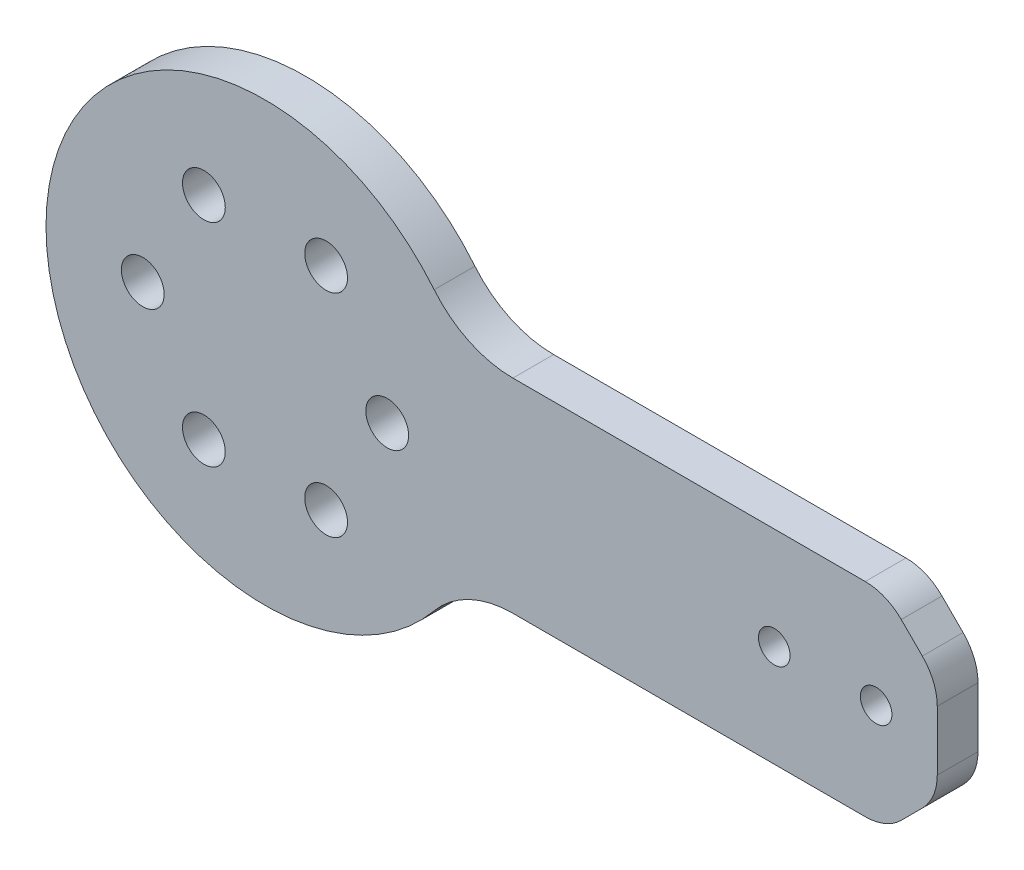
ISO-10303-21;
HEADER;
FILE_DESCRIPTION(('STEP AP214'),'2;1');
FILE_NAME('part.step','',(''),(''),'','','');
FILE_SCHEMA(('AUTOMOTIVE_DESIGN { 1 0 10303 214 1 1 1 1 }'));
ENDSEC;
DATA;
#1=APPLICATION_CONTEXT('core data for automotive mechanical design processes');
#2=APPLICATION_PROTOCOL_DEFINITION('international standard','automotive_design',2000,#1);
#3=PRODUCT_CONTEXT('',#1,'mechanical');
#4=PRODUCT('Part','Part','',(#3));
#5=PRODUCT_RELATED_PRODUCT_CATEGORY('part','',(#4));
#6=PRODUCT_DEFINITION_FORMATION('','',#4);
#7=PRODUCT_DEFINITION_CONTEXT('part definition',#1,'design');
#8=PRODUCT_DEFINITION('design','',#6,#7);
#9=PRODUCT_DEFINITION_SHAPE('','',#8);
#10=(LENGTH_UNIT() NAMED_UNIT(*) SI_UNIT(.MILLI.,.METRE.));
#11=(NAMED_UNIT(*) PLANE_ANGLE_UNIT() SI_UNIT($,.RADIAN.));
#12=(NAMED_UNIT(*) SI_UNIT($,.STERADIAN.) SOLID_ANGLE_UNIT());
#13=UNCERTAINTY_MEASURE_WITH_UNIT(LENGTH_MEASURE(1.E-05),#10,'distance_accuracy_value','');
#14=(GEOMETRIC_REPRESENTATION_CONTEXT(3) GLOBAL_UNCERTAINTY_ASSIGNED_CONTEXT((#13)) GLOBAL_UNIT_ASSIGNED_CONTEXT((#10,
#11,#12)) REPRESENTATION_CONTEXT('',''));
#15=CARTESIAN_POINT('',(0.,0.,0.));
#16=DIRECTION('',(0.,0.,1.));
#17=DIRECTION('',(1.,0.,0.));
#18=AXIS2_PLACEMENT_3D('',#15,#16,#17);
#19=CARTESIAN_POINT('',(0.,0.,4.));
#20=DIRECTION('',(0.,0.,1.));
#21=DIRECTION('',(1.,0.,0.));
#22=AXIS2_PLACEMENT_3D('',#19,#20,#21);
#23=PLANE('',#22);
#24=CARTESIAN_POINT('',(60.,0.,4.));
#25=DIRECTION('',(0.,0.,1.));
#26=DIRECTION('',(1.,0.,0.));
#27=AXIS2_PLACEMENT_3D('',#24,#25,#26);
#28=CIRCLE('',#27,1.54999999999999);
#29=CARTESIAN_POINT('',(61.55,0.,4.));
#30=VERTEX_POINT('',#29);
#31=EDGE_CURVE('E261',#30,#30,#28,.T.);
#32=ORIENTED_EDGE('',*,*,#31,.F.);
#33=EDGE_LOOP('',(#32));
#34=FACE_BOUND('',#33,.T.);
#35=CARTESIAN_POINT('',(50.,0.,4.));
#36=DIRECTION('',(0.,0.,1.));
#37=DIRECTION('',(1.,0.,0.));
#38=AXIS2_PLACEMENT_3D('',#35,#36,#37);
#39=CIRCLE('',#38,1.55);
#40=CARTESIAN_POINT('',(51.55,0.,4.));
#41=VERTEX_POINT('',#40);
#42=EDGE_CURVE('E280',#41,#41,#39,.T.);
#43=ORIENTED_EDGE('',*,*,#42,.F.);
#44=EDGE_LOOP('',(#43));
#45=FACE_BOUND('',#44,.T.);
#46=CARTESIAN_POINT('',(-5.9999999999999,10.3923048454133,4.));
#47=DIRECTION('',(0.,0.,1.));
#48=DIRECTION('',(1.,0.,0.));
#49=AXIS2_PLACEMENT_3D('',#46,#47,#48);
#50=CIRCLE('',#49,2.1);
#51=CARTESIAN_POINT('',(-3.8999999999999,10.3923048454133,4.));
#52=VERTEX_POINT('',#51);
#53=EDGE_CURVE('E266',#52,#52,#50,.T.);
#54=ORIENTED_EDGE('',*,*,#53,.F.);
#55=EDGE_LOOP('',(#54));
#56=FACE_BOUND('',#55,.T.);
#57=CARTESIAN_POINT('',(-6.00000000000005,-10.3923048454132,4.));
#58=DIRECTION('',(0.,0.,1.));
#59=DIRECTION('',(1.,0.,0.));
#60=AXIS2_PLACEMENT_3D('',#57,#58,#59);
#61=CIRCLE('',#60,2.1);
#62=CARTESIAN_POINT('',(-3.90000000000005,-10.3923048454132,4.));
#63=VERTEX_POINT('',#62);
#64=EDGE_CURVE('E276',#63,#63,#61,.T.);
#65=ORIENTED_EDGE('',*,*,#64,.F.);
#66=EDGE_LOOP('',(#65));
#67=FACE_BOUND('',#66,.T.);
#68=CARTESIAN_POINT('',(12.,0.,4.));
#69=DIRECTION('',(0.,0.,1.));
#70=DIRECTION('',(1.,0.,0.));
#71=AXIS2_PLACEMENT_3D('',#68,#69,#70);
#72=CIRCLE('',#71,2.1);
#73=CARTESIAN_POINT('',(14.1,0.,4.));
#74=VERTEX_POINT('',#73);
#75=EDGE_CURVE('E179',#74,#74,#72,.T.);
#76=ORIENTED_EDGE('',*,*,#75,.F.);
#77=EDGE_LOOP('',(#76));
#78=FACE_BOUND('',#77,.T.);
#79=DIRECTION('',(1.,0.,0.));
#80=VECTOR('',#79,1.);
#81=CARTESIAN_POINT('',(66.,-10.,4.));
#82=LINE('',#81,#80);
#83=CARTESIAN_POINT('',(24.3361870472759,-10.,4.));
#84=VERTEX_POINT('',#83);
#85=CARTESIAN_POINT('',(58.9289321881345,-10.,4.));
#86=VERTEX_POINT('',#85);
#87=EDGE_CURVE('E158',#84,#86,#82,.T.);
#88=ORIENTED_EDGE('',*,*,#87,.T.);
#89=CARTESIAN_POINT('',(58.9289321881345,-5.,4.));
#90=DIRECTION('',(0.,0.,1.));
#91=DIRECTION('',(1.,0.,0.));
#92=AXIS2_PLACEMENT_3D('',#89,#90,#91);
#93=CIRCLE('',#92,5.);
#94=CARTESIAN_POINT('',(62.4644660940673,-8.53553390593273,4.));
#95=VERTEX_POINT('',#94);
#96=EDGE_CURVE('E229',#86,#95,#93,.T.);
#97=ORIENTED_EDGE('',*,*,#96,.T.);
#98=DIRECTION('',(-0.707106781186548,-0.707106781186547,0.));
#99=VECTOR('',#98,1.);
#100=CARTESIAN_POINT('',(35.5,-35.5,4.));
#101=LINE('',#100,#99);
#102=CARTESIAN_POINT('',(64.5355339059327,-6.46446609406726,4.));
#103=VERTEX_POINT('',#102);
#104=EDGE_CURVE('E161',#95,#103,#101,.F.);
#105=ORIENTED_EDGE('',*,*,#104,.T.);
#106=CARTESIAN_POINT('',(61.,-2.92893218813453,4.));
#107=DIRECTION('',(0.,0.,1.));
#108=DIRECTION('',(1.,0.,0.));
#109=AXIS2_PLACEMENT_3D('',#106,#107,#108);
#110=CIRCLE('',#109,5.);
#111=CARTESIAN_POINT('',(66.,-2.92893218813453,4.));
#112=VERTEX_POINT('',#111);
#113=EDGE_CURVE('E226',#103,#112,#110,.T.);
#114=ORIENTED_EDGE('',*,*,#113,.T.);
#115=DIRECTION('',(0.,1.,0.));
#116=VECTOR('',#115,1.);
#117=CARTESIAN_POINT('',(66.,-10.,4.));
#118=LINE('',#117,#116);
#119=CARTESIAN_POINT('',(66.,2.92893218813453,4.));
#120=VERTEX_POINT('',#119);
#121=EDGE_CURVE('E264',#112,#120,#118,.T.);
#122=ORIENTED_EDGE('',*,*,#121,.T.);
#123=CARTESIAN_POINT('',(61.,2.92893218813453,4.));
#124=DIRECTION('',(0.,0.,1.));
#125=DIRECTION('',(1.,0.,0.));
#126=AXIS2_PLACEMENT_3D('',#123,#124,#125);
#127=CIRCLE('',#126,5.);
#128=CARTESIAN_POINT('',(64.5355339059328,6.46446609406725,4.));
#129=VERTEX_POINT('',#128);
#130=EDGE_CURVE('E223',#120,#129,#127,.T.);
#131=ORIENTED_EDGE('',*,*,#130,.T.);
#132=DIRECTION('',(0.707106781186547,-0.707106781186549,0.));
#133=VECTOR('',#132,1.);
#134=CARTESIAN_POINT('',(35.5000000000001,35.5,4.));
#135=LINE('',#134,#133);
#136=CARTESIAN_POINT('',(62.4644660940673,8.53553390593273,4.));
#137=VERTEX_POINT('',#136);
#138=EDGE_CURVE('E193',#129,#137,#135,.F.);
#139=ORIENTED_EDGE('',*,*,#138,.T.);
#140=CARTESIAN_POINT('',(58.9289321881345,5.,4.));
#141=DIRECTION('',(0.,0.,1.));
#142=DIRECTION('',(1.,0.,0.));
#143=AXIS2_PLACEMENT_3D('',#140,#141,#142);
#144=CIRCLE('',#143,5.);
#145=CARTESIAN_POINT('',(58.9289321881345,10.,4.));
#146=VERTEX_POINT('',#145);
#147=EDGE_CURVE('E220',#137,#146,#144,.T.);
#148=ORIENTED_EDGE('',*,*,#147,.T.);
#149=DIRECTION('',(-1.,0.,0.));
#150=VECTOR('',#149,1.);
#151=CARTESIAN_POINT('',(19.0328663106743,10.,4.));
#152=LINE('',#151,#150);
#153=CARTESIAN_POINT('',(24.3361870472759,10.,4.));
#154=VERTEX_POINT('',#153);
#155=EDGE_CURVE('E190',#146,#154,#152,.T.);
#156=ORIENTED_EDGE('',*,*,#155,.T.);
#157=CARTESIAN_POINT('',(24.3361870472759,20.,4.));
#158=DIRECTION('',(0.,0.,1.));
#159=DIRECTION('',(1.,0.,0.));
#160=AXIS2_PLACEMENT_3D('',#157,#158,#159);
#161=CIRCLE('',#160,10.);
#162=CARTESIAN_POINT('',(16.610413381474,13.6507936507937,4.));
#163=VERTEX_POINT('',#162);
#164=EDGE_CURVE('E214',#154,#163,#161,.F.);
#165=ORIENTED_EDGE('',*,*,#164,.T.);
#166=CARTESIAN_POINT('',(0.,0.,4.));
#167=DIRECTION('',(0.,0.,1.));
#168=DIRECTION('',(1.,0.,0.));
#169=AXIS2_PLACEMENT_3D('',#166,#167,#168);
#170=CIRCLE('',#169,21.5);
#171=CARTESIAN_POINT('',(16.610413381474,-13.6507936507937,4.));
#172=VERTEX_POINT('',#171);
#173=EDGE_CURVE('E185',#163,#172,#170,.T.);
#174=ORIENTED_EDGE('',*,*,#173,.T.);
#175=CARTESIAN_POINT('',(24.3361870472759,-20.,4.));
#176=DIRECTION('',(0.,0.,1.));
#177=DIRECTION('',(1.,0.,0.));
#178=AXIS2_PLACEMENT_3D('',#175,#176,#177);
#179=CIRCLE('',#178,10.);
#180=EDGE_CURVE('E147',#172,#84,#179,.F.);
#181=ORIENTED_EDGE('',*,*,#180,.T.);
#182=EDGE_LOOP('',(#88,#97,#105,#114,#122,#131,#139,#148,#156,#165,#174,#181));
#183=FACE_BOUND('',#182,.T.);
#184=CARTESIAN_POINT('',(5.99999999999998,-10.3923048454133,4.));
#185=DIRECTION('',(0.,0.,1.));
#186=DIRECTION('',(1.,0.,0.));
#187=AXIS2_PLACEMENT_3D('',#184,#185,#186);
#188=CIRCLE('',#187,2.1);
#189=CARTESIAN_POINT('',(8.09999999999998,-10.3923048454133,4.));
#190=VERTEX_POINT('',#189);
#191=EDGE_CURVE('E275',#190,#190,#188,.T.);
#192=ORIENTED_EDGE('',*,*,#191,.F.);
#193=EDGE_LOOP('',(#192));
#194=FACE_BOUND('',#193,.T.);
#195=CARTESIAN_POINT('',(-12.,0.,4.));
#196=DIRECTION('',(0.,0.,1.));
#197=DIRECTION('',(1.,0.,0.));
#198=AXIS2_PLACEMENT_3D('',#195,#196,#197);
#199=CIRCLE('',#198,2.1);
#200=CARTESIAN_POINT('',(-9.9,0.,4.));
#201=VERTEX_POINT('',#200);
#202=EDGE_CURVE('E310',#201,#201,#199,.T.);
#203=ORIENTED_EDGE('',*,*,#202,.F.);
#204=EDGE_LOOP('',(#203));
#205=FACE_BOUND('',#204,.T.);
#206=CARTESIAN_POINT('',(6.00000000000012,10.3923048454132,4.));
#207=DIRECTION('',(0.,0.,1.));
#208=DIRECTION('',(1.,0.,0.));
#209=AXIS2_PLACEMENT_3D('',#206,#207,#208);
#210=CIRCLE('',#209,2.1);
#211=CARTESIAN_POINT('',(8.10000000000012,10.3923048454132,4.));
#212=VERTEX_POINT('',#211);
#213=EDGE_CURVE('E296',#212,#212,#210,.T.);
#214=ORIENTED_EDGE('',*,*,#213,.F.);
#215=EDGE_LOOP('',(#214));
#216=FACE_BOUND('',#215,.T.);
#217=ADVANCED_FACE('F47',(#34,#45,#56,#67,#78,#183,#194,#205,#216),#23,.T.);
#218=CARTESIAN_POINT('',(0.,0.,0.));
#219=DIRECTION('',(0.,0.,1.));
#220=DIRECTION('',(1.,0.,0.));
#221=AXIS2_PLACEMENT_3D('',#218,#219,#220);
#222=PLANE('',#221);
#223=CARTESIAN_POINT('',(60.,0.,0.));
#224=DIRECTION('',(0.,0.,1.));
#225=DIRECTION('',(1.,0.,0.));
#226=AXIS2_PLACEMENT_3D('',#223,#224,#225);
#227=CIRCLE('',#226,1.54999999999999);
#228=CARTESIAN_POINT('',(61.55,0.,0.));
#229=VERTEX_POINT('',#228);
#230=EDGE_CURVE('E297',#229,#229,#227,.T.);
#231=ORIENTED_EDGE('',*,*,#230,.T.);
#232=EDGE_LOOP('',(#231));
#233=FACE_BOUND('',#232,.T.);
#234=CARTESIAN_POINT('',(50.,0.,0.));
#235=DIRECTION('',(0.,0.,1.));
#236=DIRECTION('',(1.,0.,0.));
#237=AXIS2_PLACEMENT_3D('',#234,#235,#236);
#238=CIRCLE('',#237,1.55);
#239=CARTESIAN_POINT('',(51.55,0.,0.));
#240=VERTEX_POINT('',#239);
#241=EDGE_CURVE('E278',#240,#240,#238,.T.);
#242=ORIENTED_EDGE('',*,*,#241,.T.);
#243=EDGE_LOOP('',(#242));
#244=FACE_BOUND('',#243,.T.);
#245=DIRECTION('',(0.707106781186548,0.707106781186547,0.));
#246=VECTOR('',#245,1.);
#247=CARTESIAN_POINT('',(66.,-5.00000000000001,0.));
#248=LINE('',#247,#246);
#249=CARTESIAN_POINT('',(64.5355339059327,-6.46446609406727,0.));
#250=VERTEX_POINT('',#249);
#251=CARTESIAN_POINT('',(62.4644660940673,-8.53553390593274,0.));
#252=VERTEX_POINT('',#251);
#253=EDGE_CURVE('E189',#250,#252,#248,.F.);
#254=ORIENTED_EDGE('',*,*,#253,.T.);
#255=CARTESIAN_POINT('',(58.9289321881345,-5.,0.));
#256=DIRECTION('',(0.,0.,1.));
#257=DIRECTION('',(1.,0.,0.));
#258=AXIS2_PLACEMENT_3D('',#255,#256,#257);
#259=CIRCLE('',#258,5.);
#260=CARTESIAN_POINT('',(58.9289321881345,-10.,0.));
#261=VERTEX_POINT('',#260);
#262=EDGE_CURVE('E167',#252,#261,#259,.F.);
#263=ORIENTED_EDGE('',*,*,#262,.T.);
#264=DIRECTION('',(1.,0.,0.));
#265=VECTOR('',#264,1.);
#266=CARTESIAN_POINT('',(66.,-10.,0.));
#267=LINE('',#266,#265);
#268=CARTESIAN_POINT('',(24.3361870472759,-10.,0.));
#269=VERTEX_POINT('',#268);
#270=EDGE_CURVE('E155',#269,#261,#267,.T.);
#271=ORIENTED_EDGE('',*,*,#270,.F.);
#272=CARTESIAN_POINT('',(24.3361870472759,-20.,0.));
#273=DIRECTION('',(0.,0.,1.));
#274=DIRECTION('',(1.,0.,0.));
#275=AXIS2_PLACEMENT_3D('',#272,#273,#274);
#276=CIRCLE('',#275,10.);
#277=CARTESIAN_POINT('',(16.610413381474,-13.6507936507937,0.));
#278=VERTEX_POINT('',#277);
#279=EDGE_CURVE('E137',#269,#278,#276,.T.);
#280=ORIENTED_EDGE('',*,*,#279,.T.);
#281=CARTESIAN_POINT('',(0.,0.,0.));
#282=DIRECTION('',(0.,0.,1.));
#283=DIRECTION('',(1.,0.,0.));
#284=AXIS2_PLACEMENT_3D('',#281,#282,#283);
#285=CIRCLE('',#284,21.5);
#286=CARTESIAN_POINT('',(16.610413381474,13.6507936507937,0.));
#287=VERTEX_POINT('',#286);
#288=EDGE_CURVE('E170',#287,#278,#285,.T.);
#289=ORIENTED_EDGE('',*,*,#288,.F.);
#290=CARTESIAN_POINT('',(24.3361870472759,20.,0.));
#291=DIRECTION('',(0.,0.,1.));
#292=DIRECTION('',(1.,0.,0.));
#293=AXIS2_PLACEMENT_3D('',#290,#291,#292);
#294=CIRCLE('',#293,10.);
#295=CARTESIAN_POINT('',(24.3361870472759,10.,0.));
#296=VERTEX_POINT('',#295);
#297=EDGE_CURVE('E210',#287,#296,#294,.T.);
#298=ORIENTED_EDGE('',*,*,#297,.T.);
#299=DIRECTION('',(-1.,0.,0.));
#300=VECTOR('',#299,1.);
#301=CARTESIAN_POINT('',(19.0328663106743,10.,0.));
#302=LINE('',#301,#300);
#303=CARTESIAN_POINT('',(58.9289321881345,10.,0.));
#304=VERTEX_POINT('',#303);
#305=EDGE_CURVE('E176',#304,#296,#302,.T.);
#306=ORIENTED_EDGE('',*,*,#305,.F.);
#307=CARTESIAN_POINT('',(58.9289321881345,5.,0.));
#308=DIRECTION('',(0.,0.,1.));
#309=DIRECTION('',(1.,0.,0.));
#310=AXIS2_PLACEMENT_3D('',#307,#308,#309);
#311=CIRCLE('',#310,5.);
#312=CARTESIAN_POINT('',(62.4644660940673,8.53553390593273,0.));
#313=VERTEX_POINT('',#312);
#314=EDGE_CURVE('E69',#304,#313,#311,.F.);
#315=ORIENTED_EDGE('',*,*,#314,.T.);
#316=DIRECTION('',(-0.707106781186547,0.707106781186549,0.));
#317=VECTOR('',#316,1.);
#318=CARTESIAN_POINT('',(61.,10.,0.));
#319=LINE('',#318,#317);
#320=CARTESIAN_POINT('',(64.5355339059328,6.46446609406725,0.));
#321=VERTEX_POINT('',#320);
#322=EDGE_CURVE('E186',#313,#321,#319,.F.);
#323=ORIENTED_EDGE('',*,*,#322,.T.);
#324=CARTESIAN_POINT('',(61.,2.92893218813453,0.));
#325=DIRECTION('',(0.,0.,1.));
#326=DIRECTION('',(1.,0.,0.));
#327=AXIS2_PLACEMENT_3D('',#324,#325,#326);
#328=CIRCLE('',#327,5.);
#329=CARTESIAN_POINT('',(66.,2.92893218813453,0.));
#330=VERTEX_POINT('',#329);
#331=EDGE_CURVE('E240',#321,#330,#328,.F.);
#332=ORIENTED_EDGE('',*,*,#331,.T.);
#333=DIRECTION('',(0.,1.,0.));
#334=VECTOR('',#333,1.);
#335=CARTESIAN_POINT('',(66.,-10.,0.));
#336=LINE('',#335,#334);
#337=CARTESIAN_POINT('',(66.,-2.92893218813453,0.));
#338=VERTEX_POINT('',#337);
#339=EDGE_CURVE('E169',#338,#330,#336,.T.);
#340=ORIENTED_EDGE('',*,*,#339,.F.);
#341=CARTESIAN_POINT('',(61.,-2.92893218813453,0.));
#342=DIRECTION('',(0.,0.,1.));
#343=DIRECTION('',(1.,0.,0.));
#344=AXIS2_PLACEMENT_3D('',#341,#342,#343);
#345=CIRCLE('',#344,5.);
#346=EDGE_CURVE('E243',#338,#250,#345,.F.);
#347=ORIENTED_EDGE('',*,*,#346,.T.);
#348=EDGE_LOOP('',(#254,#263,#271,#280,#289,#298,#306,#315,#323,#332,#340,#347));
#349=FACE_BOUND('',#348,.T.);
#350=CARTESIAN_POINT('',(12.,0.,0.));
#351=DIRECTION('',(0.,0.,1.));
#352=DIRECTION('',(1.,0.,0.));
#353=AXIS2_PLACEMENT_3D('',#350,#351,#352);
#354=CIRCLE('',#353,2.1);
#355=CARTESIAN_POINT('',(14.1,0.,0.));
#356=VERTEX_POINT('',#355);
#357=EDGE_CURVE('E283',#356,#356,#354,.T.);
#358=ORIENTED_EDGE('',*,*,#357,.T.);
#359=EDGE_LOOP('',(#358));
#360=FACE_BOUND('',#359,.T.);
#361=CARTESIAN_POINT('',(5.99999999999998,-10.3923048454133,0.));
#362=DIRECTION('',(0.,0.,1.));
#363=DIRECTION('',(1.,0.,0.));
#364=AXIS2_PLACEMENT_3D('',#361,#362,#363);
#365=CIRCLE('',#364,2.1);
#366=CARTESIAN_POINT('',(8.09999999999998,-10.3923048454133,0.));
#367=VERTEX_POINT('',#366);
#368=EDGE_CURVE('E272',#367,#367,#365,.T.);
#369=ORIENTED_EDGE('',*,*,#368,.T.);
#370=EDGE_LOOP('',(#369));
#371=FACE_BOUND('',#370,.T.);
#372=CARTESIAN_POINT('',(-6.00000000000005,-10.3923048454132,0.));
#373=DIRECTION('',(0.,0.,1.));
#374=DIRECTION('',(1.,0.,0.));
#375=AXIS2_PLACEMENT_3D('',#372,#373,#374);
#376=CIRCLE('',#375,2.1);
#377=CARTESIAN_POINT('',(-3.90000000000005,-10.3923048454132,0.));
#378=VERTEX_POINT('',#377);
#379=EDGE_CURVE('E318',#378,#378,#376,.T.);
#380=ORIENTED_EDGE('',*,*,#379,.T.);
#381=EDGE_LOOP('',(#380));
#382=FACE_BOUND('',#381,.T.);
#383=CARTESIAN_POINT('',(-12.,0.,0.));
#384=DIRECTION('',(0.,0.,1.));
#385=DIRECTION('',(1.,0.,0.));
#386=AXIS2_PLACEMENT_3D('',#383,#384,#385);
#387=CIRCLE('',#386,2.1);
#388=CARTESIAN_POINT('',(-9.9,0.,0.));
#389=VERTEX_POINT('',#388);
#390=EDGE_CURVE('E268',#389,#389,#387,.T.);
#391=ORIENTED_EDGE('',*,*,#390,.T.);
#392=EDGE_LOOP('',(#391));
#393=FACE_BOUND('',#392,.T.);
#394=CARTESIAN_POINT('',(-5.9999999999999,10.3923048454133,0.));
#395=DIRECTION('',(0.,0.,1.));
#396=DIRECTION('',(1.,0.,0.));
#397=AXIS2_PLACEMENT_3D('',#394,#395,#396);
#398=CIRCLE('',#397,2.1);
#399=CARTESIAN_POINT('',(-3.8999999999999,10.3923048454133,0.));
#400=VERTEX_POINT('',#399);
#401=EDGE_CURVE('E269',#400,#400,#398,.T.);
#402=ORIENTED_EDGE('',*,*,#401,.T.);
#403=EDGE_LOOP('',(#402));
#404=FACE_BOUND('',#403,.T.);
#405=CARTESIAN_POINT('',(6.00000000000012,10.3923048454132,0.));
#406=DIRECTION('',(0.,0.,1.));
#407=DIRECTION('',(1.,0.,0.));
#408=AXIS2_PLACEMENT_3D('',#405,#406,#407);
#409=CIRCLE('',#408,2.1);
#410=CARTESIAN_POINT('',(8.10000000000012,10.3923048454132,0.));
#411=VERTEX_POINT('',#410);
#412=EDGE_CURVE('E294',#411,#411,#409,.T.);
#413=ORIENTED_EDGE('',*,*,#412,.T.);
#414=EDGE_LOOP('',(#413));
#415=FACE_BOUND('',#414,.T.);
#416=ADVANCED_FACE('F164',(#233,#244,#349,#360,#371,#382,#393,#404,#415),#222,.F.);
#417=CARTESIAN_POINT('',(0.,0.,4.));
#418=DIRECTION('',(0.,0.,-1.));
#419=DIRECTION('',(-1.,0.,0.));
#420=AXIS2_PLACEMENT_3D('',#417,#418,#419);
#421=CYLINDRICAL_SURFACE('',#420,21.5);
#422=ORIENTED_EDGE('',*,*,#288,.T.);
#423=DIRECTION('',(0.,0.,-1.));
#424=VECTOR('',#423,1.);
#425=CARTESIAN_POINT('',(16.610413381474,-13.6507936507937,4.));
#426=LINE('',#425,#424);
#427=EDGE_CURVE('E142',#278,#172,#426,.F.);
#428=ORIENTED_EDGE('',*,*,#427,.T.);
#429=ORIENTED_EDGE('',*,*,#173,.F.);
#430=DIRECTION('',(0.,0.,-1.));
#431=VECTOR('',#430,1.);
#432=CARTESIAN_POINT('',(16.610413381474,13.6507936507937,4.));
#433=LINE('',#432,#431);
#434=EDGE_CURVE('E160',#163,#287,#433,.T.);
#435=ORIENTED_EDGE('',*,*,#434,.T.);
#436=EDGE_LOOP('',(#422,#428,#429,#435));
#437=FACE_BOUND('',#436,.T.);
#438=ADVANCED_FACE('F355',(#437),#421,.T.);
#439=CARTESIAN_POINT('',(66.,-10.,4.));
#440=DIRECTION('',(0.,1.,0.));
#441=DIRECTION('',(-1.,0.,0.));
#442=AXIS2_PLACEMENT_3D('',#439,#440,#441);
#443=PLANE('',#442);
#444=ORIENTED_EDGE('',*,*,#270,.T.);
#445=DIRECTION('',(0.,0.,-1.));
#446=VECTOR('',#445,1.);
#447=CARTESIAN_POINT('',(58.9289321881345,-10.,4.));
#448=LINE('',#447,#446);
#449=EDGE_CURVE('E217',#261,#86,#448,.F.);
#450=ORIENTED_EDGE('',*,*,#449,.T.);
#451=ORIENTED_EDGE('',*,*,#87,.F.);
#452=DIRECTION('',(0.,0.,1.));
#453=VECTOR('',#452,1.);
#454=CARTESIAN_POINT('',(24.3361870472759,-10.,0.));
#455=LINE('',#454,#453);
#456=EDGE_CURVE('E141',#84,#269,#455,.F.);
#457=ORIENTED_EDGE('',*,*,#456,.T.);
#458=EDGE_LOOP('',(#444,#450,#451,#457));
#459=FACE_BOUND('',#458,.T.);
#460=ADVANCED_FACE('F153',(#459),#443,.F.);
#461=CARTESIAN_POINT('',(66.,-10.,4.));
#462=DIRECTION('',(-1.,0.,0.));
#463=DIRECTION('',(0.,0.,1.));
#464=AXIS2_PLACEMENT_3D('',#461,#462,#463);
#465=PLANE('',#464);
#466=ORIENTED_EDGE('',*,*,#121,.F.);
#467=DIRECTION('',(0.,0.,1.));
#468=VECTOR('',#467,1.);
#469=CARTESIAN_POINT('',(66.,-2.92893218813453,0.));
#470=LINE('',#469,#468);
#471=EDGE_CURVE('E252',#112,#338,#470,.F.);
#472=ORIENTED_EDGE('',*,*,#471,.T.);
#473=ORIENTED_EDGE('',*,*,#339,.T.);
#474=DIRECTION('',(0.,0.,-1.));
#475=VECTOR('',#474,1.);
#476=CARTESIAN_POINT('',(66.,2.92893218813453,4.));
#477=LINE('',#476,#475);
#478=EDGE_CURVE('E248',#330,#120,#477,.F.);
#479=ORIENTED_EDGE('',*,*,#478,.T.);
#480=EDGE_LOOP('',(#466,#472,#473,#479));
#481=FACE_BOUND('',#480,.T.);
#482=ADVANCED_FACE('F368',(#481),#465,.F.);
#483=CARTESIAN_POINT('',(19.0328663106743,10.,4.));
#484=DIRECTION('',(0.,-1.,0.));
#485=DIRECTION('',(0.,0.,-1.));
#486=AXIS2_PLACEMENT_3D('',#483,#484,#485);
#487=PLANE('',#486);
#488=ORIENTED_EDGE('',*,*,#155,.F.);
#489=DIRECTION('',(0.,0.,1.));
#490=VECTOR('',#489,1.);
#491=CARTESIAN_POINT('',(58.9289321881345,10.,0.));
#492=LINE('',#491,#490);
#493=EDGE_CURVE('E11',#146,#304,#492,.F.);
#494=ORIENTED_EDGE('',*,*,#493,.T.);
#495=ORIENTED_EDGE('',*,*,#305,.T.);
#496=DIRECTION('',(0.,0.,1.));
#497=VECTOR('',#496,1.);
#498=CARTESIAN_POINT('',(24.3361870472759,10.,4.));
#499=LINE('',#498,#497);
#500=EDGE_CURVE('E148',#296,#154,#499,.T.);
#501=ORIENTED_EDGE('',*,*,#500,.T.);
#502=EDGE_LOOP('',(#488,#494,#495,#501));
#503=FACE_BOUND('',#502,.T.);
#504=ADVANCED_FACE('F365',(#503),#487,.F.);
#505=CARTESIAN_POINT('',(12.,0.,4.));
#506=DIRECTION('',(0.,0.,-1.));
#507=DIRECTION('',(-1.,0.,0.));
#508=AXIS2_PLACEMENT_3D('',#505,#506,#507);
#509=CYLINDRICAL_SURFACE('',#508,2.1);
#510=ORIENTED_EDGE('',*,*,#75,.T.);
#511=EDGE_LOOP('',(#510));
#512=FACE_BOUND('',#511,.T.);
#513=ORIENTED_EDGE('',*,*,#357,.F.);
#514=EDGE_LOOP('',(#513));
#515=FACE_BOUND('',#514,.T.);
#516=ADVANCED_FACE('F332',(#512,#515),#509,.F.);
#517=CARTESIAN_POINT('',(5.99999999999998,-10.3923048454133,4.));
#518=DIRECTION('',(0.,0.,-1.));
#519=DIRECTION('',(-1.,0.,0.));
#520=AXIS2_PLACEMENT_3D('',#517,#518,#519);
#521=CYLINDRICAL_SURFACE('',#520,2.1);
#522=ORIENTED_EDGE('',*,*,#191,.T.);
#523=EDGE_LOOP('',(#522));
#524=FACE_BOUND('',#523,.T.);
#525=ORIENTED_EDGE('',*,*,#368,.F.);
#526=EDGE_LOOP('',(#525));
#527=FACE_BOUND('',#526,.T.);
#528=ADVANCED_FACE('F559',(#524,#527),#521,.F.);
#529=CARTESIAN_POINT('',(-6.00000000000005,-10.3923048454132,4.));
#530=DIRECTION('',(0.,0.,-1.));
#531=DIRECTION('',(-1.,0.,0.));
#532=AXIS2_PLACEMENT_3D('',#529,#530,#531);
#533=CYLINDRICAL_SURFACE('',#532,2.1);
#534=ORIENTED_EDGE('',*,*,#64,.T.);
#535=EDGE_LOOP('',(#534));
#536=FACE_BOUND('',#535,.T.);
#537=ORIENTED_EDGE('',*,*,#379,.F.);
#538=EDGE_LOOP('',(#537));
#539=FACE_BOUND('',#538,.T.);
#540=ADVANCED_FACE('F549',(#536,#539),#533,.F.);
#541=CARTESIAN_POINT('',(-12.,0.,4.));
#542=DIRECTION('',(0.,0.,-1.));
#543=DIRECTION('',(-1.,0.,0.));
#544=AXIS2_PLACEMENT_3D('',#541,#542,#543);
#545=CYLINDRICAL_SURFACE('',#544,2.1);
#546=ORIENTED_EDGE('',*,*,#202,.T.);
#547=EDGE_LOOP('',(#546));
#548=FACE_BOUND('',#547,.T.);
#549=ORIENTED_EDGE('',*,*,#390,.F.);
#550=EDGE_LOOP('',(#549));
#551=FACE_BOUND('',#550,.T.);
#552=ADVANCED_FACE('F539',(#548,#551),#545,.F.);
#553=CARTESIAN_POINT('',(-5.9999999999999,10.3923048454133,4.));
#554=DIRECTION('',(0.,0.,-1.));
#555=DIRECTION('',(-1.,0.,0.));
#556=AXIS2_PLACEMENT_3D('',#553,#554,#555);
#557=CYLINDRICAL_SURFACE('',#556,2.1);
#558=ORIENTED_EDGE('',*,*,#53,.T.);
#559=EDGE_LOOP('',(#558));
#560=FACE_BOUND('',#559,.T.);
#561=ORIENTED_EDGE('',*,*,#401,.F.);
#562=EDGE_LOOP('',(#561));
#563=FACE_BOUND('',#562,.T.);
#564=ADVANCED_FACE('F350',(#560,#563),#557,.F.);
#565=CARTESIAN_POINT('',(6.00000000000012,10.3923048454132,4.));
#566=DIRECTION('',(0.,0.,-1.));
#567=DIRECTION('',(-1.,0.,0.));
#568=AXIS2_PLACEMENT_3D('',#565,#566,#567);
#569=CYLINDRICAL_SURFACE('',#568,2.1);
#570=ORIENTED_EDGE('',*,*,#213,.T.);
#571=EDGE_LOOP('',(#570));
#572=FACE_BOUND('',#571,.T.);
#573=ORIENTED_EDGE('',*,*,#412,.F.);
#574=EDGE_LOOP('',(#573));
#575=FACE_BOUND('',#574,.T.);
#576=ADVANCED_FACE('F346',(#572,#575),#569,.F.);
#577=CARTESIAN_POINT('',(66.,-5.00000000000001,4.));
#578=DIRECTION('',(-0.707106781186547,0.707106781186548,0.));
#579=DIRECTION('',(0.,0.,-1.));
#580=AXIS2_PLACEMENT_3D('',#577,#578,#579);
#581=PLANE('',#580);
#582=ORIENTED_EDGE('',*,*,#104,.F.);
#583=DIRECTION('',(0.,0.,1.));
#584=VECTOR('',#583,1.);
#585=CARTESIAN_POINT('',(62.4644660940673,-8.53553390593274,0.));
#586=LINE('',#585,#584);
#587=EDGE_CURVE('E235',#95,#252,#586,.F.);
#588=ORIENTED_EDGE('',*,*,#587,.T.);
#589=ORIENTED_EDGE('',*,*,#253,.F.);
#590=DIRECTION('',(0.,0.,-1.));
#591=VECTOR('',#590,1.);
#592=CARTESIAN_POINT('',(64.5355339059327,-6.46446609406727,4.));
#593=LINE('',#592,#591);
#594=EDGE_CURVE('E232',#250,#103,#593,.F.);
#595=ORIENTED_EDGE('',*,*,#594,.T.);
#596=EDGE_LOOP('',(#582,#588,#589,#595));
#597=FACE_BOUND('',#596,.T.);
#598=ADVANCED_FACE('F349',(#597),#581,.F.);
#599=CARTESIAN_POINT('',(61.,10.,4.));
#600=DIRECTION('',(-0.707106781186548,-0.707106781186546,0.));
#601=DIRECTION('',(0.,0.,-1.));
#602=AXIS2_PLACEMENT_3D('',#599,#600,#601);
#603=PLANE('',#602);
#604=ORIENTED_EDGE('',*,*,#138,.F.);
#605=DIRECTION('',(0.,0.,1.));
#606=VECTOR('',#605,1.);
#607=CARTESIAN_POINT('',(64.5355339059328,6.46446609406725,0.));
#608=LINE('',#607,#606);
#609=EDGE_CURVE('E56',#129,#321,#608,.F.);
#610=ORIENTED_EDGE('',*,*,#609,.T.);
#611=ORIENTED_EDGE('',*,*,#322,.F.);
#612=DIRECTION('',(0.,0.,-1.));
#613=VECTOR('',#612,1.);
#614=CARTESIAN_POINT('',(62.4644660940673,8.53553390593273,4.));
#615=LINE('',#614,#613);
#616=EDGE_CURVE('E256',#313,#137,#615,.F.);
#617=ORIENTED_EDGE('',*,*,#616,.T.);
#618=EDGE_LOOP('',(#604,#610,#611,#617));
#619=FACE_BOUND('',#618,.T.);
#620=ADVANCED_FACE('F381',(#619),#603,.F.);
#621=CARTESIAN_POINT('',(50.,0.,0.));
#622=DIRECTION('',(0.,0.,1.));
#623=DIRECTION('',(1.,0.,0.));
#624=AXIS2_PLACEMENT_3D('',#621,#622,#623);
#625=CYLINDRICAL_SURFACE('',#624,1.55);
#626=ORIENTED_EDGE('',*,*,#241,.F.);
#627=EDGE_LOOP('',(#626));
#628=FACE_BOUND('',#627,.T.);
#629=ORIENTED_EDGE('',*,*,#42,.T.);
#630=EDGE_LOOP('',(#629));
#631=FACE_BOUND('',#630,.T.);
#632=ADVANCED_FACE('F387',(#628,#631),#625,.F.);
#633=CARTESIAN_POINT('',(60.,0.,0.));
#634=DIRECTION('',(0.,0.,1.));
#635=DIRECTION('',(1.,0.,0.));
#636=AXIS2_PLACEMENT_3D('',#633,#634,#635);
#637=CYLINDRICAL_SURFACE('',#636,1.54999999999999);
#638=ORIENTED_EDGE('',*,*,#230,.F.);
#639=EDGE_LOOP('',(#638));
#640=FACE_BOUND('',#639,.T.);
#641=ORIENTED_EDGE('',*,*,#31,.T.);
#642=EDGE_LOOP('',(#641));
#643=FACE_BOUND('',#642,.T.);
#644=ADVANCED_FACE('F391',(#640,#643),#637,.F.);
#645=CARTESIAN_POINT('',(24.3361870472759,-20.,4.));
#646=DIRECTION('',(0.,0.,-1.));
#647=DIRECTION('',(-1.,0.,0.));
#648=AXIS2_PLACEMENT_3D('',#645,#646,#647);
#649=CYLINDRICAL_SURFACE('',#648,10.);
#650=ORIENTED_EDGE('',*,*,#180,.F.);
#651=ORIENTED_EDGE('',*,*,#427,.F.);
#652=ORIENTED_EDGE('',*,*,#279,.F.);
#653=ORIENTED_EDGE('',*,*,#456,.F.);
#654=EDGE_LOOP('',(#650,#651,#652,#653));
#655=FACE_BOUND('',#654,.T.);
#656=ADVANCED_FACE('F140',(#655),#649,.F.);
#657=CARTESIAN_POINT('',(24.3361870472759,20.,4.));
#658=DIRECTION('',(0.,0.,-1.));
#659=DIRECTION('',(-1.,0.,0.));
#660=AXIS2_PLACEMENT_3D('',#657,#658,#659);
#661=CYLINDRICAL_SURFACE('',#660,10.);
#662=ORIENTED_EDGE('',*,*,#164,.F.);
#663=ORIENTED_EDGE('',*,*,#500,.F.);
#664=ORIENTED_EDGE('',*,*,#297,.F.);
#665=ORIENTED_EDGE('',*,*,#434,.F.);
#666=EDGE_LOOP('',(#662,#663,#664,#665));
#667=FACE_BOUND('',#666,.T.);
#668=ADVANCED_FACE('F390',(#667),#661,.F.);
#669=CARTESIAN_POINT('',(58.9289321881345,-5.,4.));
#670=DIRECTION('',(0.,0.,1.));
#671=DIRECTION('',(1.,0.,0.));
#672=AXIS2_PLACEMENT_3D('',#669,#670,#671);
#673=CYLINDRICAL_SURFACE('',#672,5.);
#674=ORIENTED_EDGE('',*,*,#262,.F.);
#675=ORIENTED_EDGE('',*,*,#587,.F.);
#676=ORIENTED_EDGE('',*,*,#96,.F.);
#677=ORIENTED_EDGE('',*,*,#449,.F.);
#678=EDGE_LOOP('',(#674,#675,#676,#677));
#679=FACE_BOUND('',#678,.T.);
#680=ADVANCED_FACE('F394',(#679),#673,.T.);
#681=CARTESIAN_POINT('',(61.,-2.92893218813453,4.));
#682=DIRECTION('',(0.,0.,-1.));
#683=DIRECTION('',(-1.,0.,0.));
#684=AXIS2_PLACEMENT_3D('',#681,#682,#683);
#685=CYLINDRICAL_SURFACE('',#684,5.);
#686=ORIENTED_EDGE('',*,*,#113,.F.);
#687=ORIENTED_EDGE('',*,*,#594,.F.);
#688=ORIENTED_EDGE('',*,*,#346,.F.);
#689=ORIENTED_EDGE('',*,*,#471,.F.);
#690=EDGE_LOOP('',(#686,#687,#688,#689));
#691=FACE_BOUND('',#690,.T.);
#692=ADVANCED_FACE('F398',(#691),#685,.T.);
#693=CARTESIAN_POINT('',(61.,2.92893218813453,4.));
#694=DIRECTION('',(0.,0.,1.));
#695=DIRECTION('',(1.,0.,0.));
#696=AXIS2_PLACEMENT_3D('',#693,#694,#695);
#697=CYLINDRICAL_SURFACE('',#696,5.);
#698=ORIENTED_EDGE('',*,*,#331,.F.);
#699=ORIENTED_EDGE('',*,*,#609,.F.);
#700=ORIENTED_EDGE('',*,*,#130,.F.);
#701=ORIENTED_EDGE('',*,*,#478,.F.);
#702=EDGE_LOOP('',(#698,#699,#700,#701));
#703=FACE_BOUND('',#702,.T.);
#704=ADVANCED_FACE('F401',(#703),#697,.T.);
#705=CARTESIAN_POINT('',(58.9289321881345,5.,4.));
#706=DIRECTION('',(0.,0.,-1.));
#707=DIRECTION('',(-1.,0.,0.));
#708=AXIS2_PLACEMENT_3D('',#705,#706,#707);
#709=CYLINDRICAL_SURFACE('',#708,5.);
#710=ORIENTED_EDGE('',*,*,#147,.F.);
#711=ORIENTED_EDGE('',*,*,#616,.F.);
#712=ORIENTED_EDGE('',*,*,#314,.F.);
#713=ORIENTED_EDGE('',*,*,#493,.F.);
#714=EDGE_LOOP('',(#710,#711,#712,#713));
#715=FACE_BOUND('',#714,.T.);
#716=ADVANCED_FACE('F49',(#715),#709,.T.);
#717=CLOSED_SHELL('',(#217,#416,#438,#460,#482,#504,#516,#528,#540,#552,#564,#576,#598,#620,
#632,#644,#656,#668,#680,#692,#704,#716));
#718=MANIFOLD_SOLID_BREP('B2',#717);
#719=ADVANCED_BREP_SHAPE_REPRESENTATION('',(#18,#718),#14);
#720=SHAPE_DEFINITION_REPRESENTATION(#9,#719);
ENDSEC;
END-ISO-10303-21;
